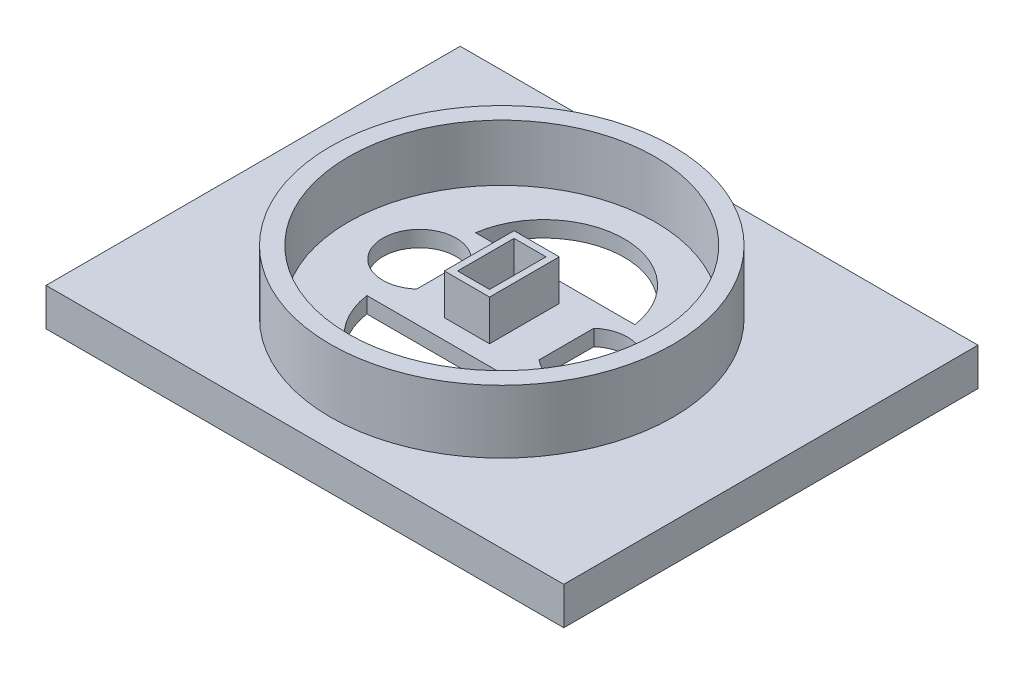
ISO-10303-21;
HEADER;
FILE_DESCRIPTION(('STEP AP214'),'2;1');
FILE_NAME('part.step','',(''),(''),'','','');
FILE_SCHEMA(('AUTOMOTIVE_DESIGN { 1 0 10303 214 1 1 1 1 }'));
ENDSEC;
DATA;
#1=APPLICATION_CONTEXT('core data for automotive mechanical design processes');
#2=APPLICATION_PROTOCOL_DEFINITION('international standard','automotive_design',2000,#1);
#3=PRODUCT_CONTEXT('',#1,'mechanical');
#4=PRODUCT('Part','Part','',(#3));
#5=PRODUCT_RELATED_PRODUCT_CATEGORY('part','',(#4));
#6=PRODUCT_DEFINITION_FORMATION('','',#4);
#7=PRODUCT_DEFINITION_CONTEXT('part definition',#1,'design');
#8=PRODUCT_DEFINITION('design','',#6,#7);
#9=PRODUCT_DEFINITION_SHAPE('','',#8);
#10=(LENGTH_UNIT() NAMED_UNIT(*) SI_UNIT(.MILLI.,.METRE.));
#11=(NAMED_UNIT(*) PLANE_ANGLE_UNIT() SI_UNIT($,.RADIAN.));
#12=(NAMED_UNIT(*) SI_UNIT($,.STERADIAN.) SOLID_ANGLE_UNIT());
#13=UNCERTAINTY_MEASURE_WITH_UNIT(LENGTH_MEASURE(1.E-05),#10,'distance_accuracy_value','');
#14=(GEOMETRIC_REPRESENTATION_CONTEXT(3) GLOBAL_UNCERTAINTY_ASSIGNED_CONTEXT((#13)) GLOBAL_UNIT_ASSIGNED_CONTEXT((#10,
#11,#12)) REPRESENTATION_CONTEXT('',''));
#15=CARTESIAN_POINT('',(0.,0.,0.));
#16=DIRECTION('',(0.,0.,1.));
#17=DIRECTION('',(1.,0.,0.));
#18=AXIS2_PLACEMENT_3D('',#15,#16,#17);
#19=CARTESIAN_POINT('',(0.,5.,0.));
#20=DIRECTION('',(0.,-1.,0.));
#21=DIRECTION('',(0.,0.,-1.));
#22=AXIS2_PLACEMENT_3D('',#19,#20,#21);
#23=PLANE('',#22);
#24=DIRECTION('',(0.,0.,-1.));
#25=VECTOR('',#24,1.);
#26=CARTESIAN_POINT('',(2.4,5.,0.));
#27=LINE('',#26,#25);
#28=CARTESIAN_POINT('',(2.4,5.,50.4904600702146));
#29=VERTEX_POINT('',#28);
#30=CARTESIAN_POINT('',(2.4,5.,43.0904600702146));
#31=VERTEX_POINT('',#30);
#32=EDGE_CURVE('E427',#29,#31,#27,.T.);
#33=ORIENTED_EDGE('',*,*,#32,.T.);
#34=DIRECTION('',(-1.,0.,0.));
#35=VECTOR('',#34,1.);
#36=CARTESIAN_POINT('',(0.,5.,43.0904600702146));
#37=LINE('',#36,#35);
#38=CARTESIAN_POINT('',(-2.4,5.,43.0904600702146));
#39=VERTEX_POINT('',#38);
#40=EDGE_CURVE('E456',#31,#39,#37,.T.);
#41=ORIENTED_EDGE('',*,*,#40,.T.);
#42=DIRECTION('',(0.,0.,1.));
#43=VECTOR('',#42,1.);
#44=CARTESIAN_POINT('',(-2.4,5.,0.));
#45=LINE('',#44,#43);
#46=CARTESIAN_POINT('',(-2.4,5.,50.4904600702146));
#47=VERTEX_POINT('',#46);
#48=EDGE_CURVE('E459',#39,#47,#45,.T.);
#49=ORIENTED_EDGE('',*,*,#48,.T.);
#50=DIRECTION('',(1.,0.,0.));
#51=VECTOR('',#50,1.);
#52=CARTESIAN_POINT('',(0.,5.,50.4904600702146));
#53=LINE('',#52,#51);
#54=EDGE_CURVE('E447',#47,#29,#53,.T.);
#55=ORIENTED_EDGE('',*,*,#54,.T.);
#56=EDGE_LOOP('',(#33,#41,#49,#55));
#57=FACE_BOUND('',#56,.T.);
#58=DIRECTION('',(0.,0.,-1.));
#59=VECTOR('',#58,1.);
#60=CARTESIAN_POINT('',(1.7,5.,43.7904600702146));
#61=LINE('',#60,#59);
#62=CARTESIAN_POINT('',(1.7,5.,49.7904600702146));
#63=VERTEX_POINT('',#62);
#64=CARTESIAN_POINT('',(1.7,5.,43.7904600702146));
#65=VERTEX_POINT('',#64);
#66=EDGE_CURVE('E357',#63,#65,#61,.T.);
#67=ORIENTED_EDGE('',*,*,#66,.F.);
#68=DIRECTION('',(1.,0.,0.));
#69=VECTOR('',#68,1.);
#70=CARTESIAN_POINT('',(1.7,5.,49.7904600702146));
#71=LINE('',#70,#69);
#72=CARTESIAN_POINT('',(-1.7,5.,49.7904600702146));
#73=VERTEX_POINT('',#72);
#74=EDGE_CURVE('E368',#73,#63,#71,.T.);
#75=ORIENTED_EDGE('',*,*,#74,.F.);
#76=DIRECTION('',(0.,0.,1.));
#77=VECTOR('',#76,1.);
#78=CARTESIAN_POINT('',(-1.7,5.,43.7904600702146));
#79=LINE('',#78,#77);
#80=CARTESIAN_POINT('',(-1.7,5.,43.7904600702146));
#81=VERTEX_POINT('',#80);
#82=EDGE_CURVE('E364',#81,#73,#79,.T.);
#83=ORIENTED_EDGE('',*,*,#82,.F.);
#84=DIRECTION('',(-1.,0.,0.));
#85=VECTOR('',#84,1.);
#86=CARTESIAN_POINT('',(1.7,5.,43.7904600702146));
#87=LINE('',#86,#85);
#88=EDGE_CURVE('E360',#65,#81,#87,.T.);
#89=ORIENTED_EDGE('',*,*,#88,.F.);
#90=EDGE_LOOP('',(#67,#75,#83,#89));
#91=FACE_BOUND('',#90,.T.);
#92=ADVANCED_FACE('F42',(#57,#91),#23,.F.);
#93=CARTESIAN_POINT('',(0.,0.7,46.7904600702146));
#94=DIRECTION('',(0.,1.,0.));
#95=DIRECTION('',(0.,0.,1.));
#96=AXIS2_PLACEMENT_3D('',#93,#94,#95);
#97=PLANE('',#96);
#98=CARTESIAN_POINT('',(-0.100326446196328,0.7,42.2169872096025));
#99=DIRECTION('',(0.,1.,0.));
#100=DIRECTION('',(0.,0.,-1.));
#101=AXIS2_PLACEMENT_3D('',#98,#99,#100);
#102=CIRCLE('',#101,8.53948836012272);
#103=CARTESIAN_POINT('',(8.35417371741275,0.7,41.015201689551));
#104=VERTEX_POINT('',#103);
#105=CARTESIAN_POINT('',(-8.55482660980541,0.7,41.015201689551));
#106=VERTEX_POINT('',#105);
#107=EDGE_CURVE('E59',#104,#106,#102,.T.);
#108=ORIENTED_EDGE('',*,*,#107,.F.);
#109=DIRECTION('',(1.,0.,0.));
#110=VECTOR('',#109,1.);
#111=CARTESIAN_POINT('',(-8.55482660980541,0.7,41.015201689551));
#112=LINE('',#111,#110);
#113=EDGE_CURVE('E215',#106,#104,#112,.T.);
#114=ORIENTED_EDGE('',*,*,#113,.F.);
#115=EDGE_LOOP('',(#108,#114));
#116=FACE_BOUND('',#115,.T.);
#117=CARTESIAN_POINT('',(9.10015565162068,0.7,46.429095644084));
#118=DIRECTION('',(0.,1.,0.));
#119=DIRECTION('',(0.,0.,-1.));
#120=AXIS2_PLACEMENT_3D('',#117,#118,#119);
#121=CIRCLE('',#120,3.89068751675184);
#122=CARTESIAN_POINT('',(6.50683123406386,0.7,49.3294607621877));
#123=VERTEX_POINT('',#122);
#124=CARTESIAN_POINT('',(6.50683123406386,0.7,43.5287305259804));
#125=VERTEX_POINT('',#124);
#126=EDGE_CURVE('E67',#123,#125,#121,.T.);
#127=ORIENTED_EDGE('',*,*,#126,.F.);
#128=DIRECTION('',(0.,0.,1.));
#129=VECTOR('',#128,1.);
#130=CARTESIAN_POINT('',(6.50683123406386,0.7,43.5287305259804));
#131=LINE('',#130,#129);
#132=EDGE_CURVE('E233',#125,#123,#131,.T.);
#133=ORIENTED_EDGE('',*,*,#132,.F.);
#134=EDGE_LOOP('',(#127,#133));
#135=FACE_BOUND('',#134,.T.);
#136=CARTESIAN_POINT('',(-9.10015565162067,0.7,46.429095644084));
#137=DIRECTION('',(0.,1.,0.));
#138=DIRECTION('',(0.,0.,1.));
#139=AXIS2_PLACEMENT_3D('',#136,#137,#138);
#140=CIRCLE('',#139,3.89068751675185);
#141=CARTESIAN_POINT('',(-6.50683123406386,0.7,43.5287305259804));
#142=VERTEX_POINT('',#141);
#143=CARTESIAN_POINT('',(-6.50683123406386,0.7,49.3294607621877));
#144=VERTEX_POINT('',#143);
#145=EDGE_CURVE('E241',#142,#144,#140,.T.);
#146=ORIENTED_EDGE('',*,*,#145,.F.);
#147=DIRECTION('',(0.,0.,-1.));
#148=VECTOR('',#147,1.);
#149=CARTESIAN_POINT('',(-6.50683123406386,0.7,43.5287305259804));
#150=LINE('',#149,#148);
#151=EDGE_CURVE('E257',#144,#142,#150,.T.);
#152=ORIENTED_EDGE('',*,*,#151,.F.);
#153=EDGE_LOOP('',(#146,#152));
#154=FACE_BOUND('',#153,.T.);
#155=CARTESIAN_POINT('',(-0.100326446196326,0.7,51.3639329308266));
#156=DIRECTION('',(0.,1.,0.));
#157=DIRECTION('',(0.,0.,1.));
#158=AXIS2_PLACEMENT_3D('',#155,#156,#157);
#159=CIRCLE('',#158,8.53948836012271);
#160=CARTESIAN_POINT('',(-8.5548266098054,0.7,52.5657184508781));
#161=VERTEX_POINT('',#160);
#162=CARTESIAN_POINT('',(8.35417371741275,0.7,52.5657184508781));
#163=VERTEX_POINT('',#162);
#164=EDGE_CURVE('E244',#161,#163,#159,.T.);
#165=ORIENTED_EDGE('',*,*,#164,.F.);
#166=DIRECTION('',(-1.,0.,0.));
#167=VECTOR('',#166,1.);
#168=CARTESIAN_POINT('',(-8.5548266098054,0.7,52.5657184508781));
#169=LINE('',#168,#167);
#170=EDGE_CURVE('E247',#163,#161,#169,.T.);
#171=ORIENTED_EDGE('',*,*,#170,.F.);
#172=EDGE_LOOP('',(#165,#171));
#173=FACE_BOUND('',#172,.T.);
#174=CARTESIAN_POINT('',(0.,0.7,46.7904600702146));
#175=DIRECTION('',(0.,1.,0.));
#176=DIRECTION('',(0.,0.,1.));
#177=AXIS2_PLACEMENT_3D('',#174,#175,#176);
#178=CIRCLE('',#177,16.3);
#179=CARTESIAN_POINT('',(0.,0.7,63.0904600702146));
#180=VERTEX_POINT('',#179);
#181=EDGE_CURVE('E411',#180,#180,#178,.T.);
#182=ORIENTED_EDGE('',*,*,#181,.T.);
#183=EDGE_LOOP('',(#182));
#184=FACE_BOUND('',#183,.T.);
#185=DIRECTION('',(-1.,0.,0.));
#186=VECTOR('',#185,1.);
#187=CARTESIAN_POINT('',(1.7,0.7,43.0904600702146));
#188=LINE('',#187,#186);
#189=CARTESIAN_POINT('',(2.4,0.7,43.0904600702146));
#190=VERTEX_POINT('',#189);
#191=CARTESIAN_POINT('',(-2.4,0.7,43.0904600702146));
#192=VERTEX_POINT('',#191);
#193=EDGE_CURVE('E417',#190,#192,#188,.T.);
#194=ORIENTED_EDGE('',*,*,#193,.F.);
#195=DIRECTION('',(0.,0.,-1.));
#196=VECTOR('',#195,1.);
#197=CARTESIAN_POINT('',(2.4,0.7,43.7904600702146));
#198=LINE('',#197,#196);
#199=CARTESIAN_POINT('',(2.4,0.7,50.4904600702146));
#200=VERTEX_POINT('',#199);
#201=EDGE_CURVE('E410',#200,#190,#198,.T.);
#202=ORIENTED_EDGE('',*,*,#201,.F.);
#203=DIRECTION('',(1.,0.,0.));
#204=VECTOR('',#203,1.);
#205=CARTESIAN_POINT('',(1.7,0.7,50.4904600702146));
#206=LINE('',#205,#204);
#207=CARTESIAN_POINT('',(-2.4,0.7,50.4904600702146));
#208=VERTEX_POINT('',#207);
#209=EDGE_CURVE('E424',#208,#200,#206,.T.);
#210=ORIENTED_EDGE('',*,*,#209,.F.);
#211=DIRECTION('',(0.,0.,1.));
#212=VECTOR('',#211,1.);
#213=CARTESIAN_POINT('',(-2.4,0.7,43.7904600702146));
#214=LINE('',#213,#212);
#215=EDGE_CURVE('E420',#192,#208,#214,.T.);
#216=ORIENTED_EDGE('',*,*,#215,.F.);
#217=EDGE_LOOP('',(#194,#202,#210,#216));
#218=FACE_BOUND('',#217,.T.);
#219=ADVANCED_FACE('F220',(#116,#135,#154,#173,#184,#218),#97,.T.);
#220=CARTESIAN_POINT('',(0.,6.,46.7904600702146));
#221=DIRECTION('',(0.,-1.,0.));
#222=DIRECTION('',(0.,0.,-1.));
#223=AXIS2_PLACEMENT_3D('',#220,#221,#222);
#224=CYLINDRICAL_SURFACE('',#223,18.2);
#225=CARTESIAN_POINT('',(0.,0.,46.7904600702146));
#226=DIRECTION('',(0.,1.,0.));
#227=DIRECTION('',(0.,0.,1.));
#228=AXIS2_PLACEMENT_3D('',#225,#226,#227);
#229=CIRCLE('',#228,18.2);
#230=CARTESIAN_POINT('',(0.,0.,64.9904600702146));
#231=VERTEX_POINT('',#230);
#232=EDGE_CURVE('E352',#231,#231,#229,.T.);
#233=ORIENTED_EDGE('',*,*,#232,.T.);
#234=EDGE_LOOP('',(#233));
#235=FACE_BOUND('',#234,.T.);
#236=CARTESIAN_POINT('',(0.,6.7,46.7904600702146));
#237=DIRECTION('',(0.,1.,0.));
#238=DIRECTION('',(0.,0.,1.));
#239=AXIS2_PLACEMENT_3D('',#236,#237,#238);
#240=CIRCLE('',#239,18.2);
#241=CARTESIAN_POINT('',(0.,6.7,64.9904600702146));
#242=VERTEX_POINT('',#241);
#243=EDGE_CURVE('E434',#242,#242,#240,.T.);
#244=ORIENTED_EDGE('',*,*,#243,.F.);
#245=EDGE_LOOP('',(#244));
#246=FACE_BOUND('',#245,.T.);
#247=ADVANCED_FACE('F570',(#235,#246),#224,.T.);
#248=CARTESIAN_POINT('',(0.,6.7,46.7904600702146));
#249=DIRECTION('',(0.,1.,0.));
#250=DIRECTION('',(0.,0.,1.));
#251=AXIS2_PLACEMENT_3D('',#248,#249,#250);
#252=PLANE('',#251);
#253=CARTESIAN_POINT('',(0.,6.7,46.7904600702146));
#254=DIRECTION('',(0.,1.,0.));
#255=DIRECTION('',(0.,0.,1.));
#256=AXIS2_PLACEMENT_3D('',#253,#254,#255);
#257=CIRCLE('',#256,16.3);
#258=CARTESIAN_POINT('',(0.,6.7,63.0904600702146));
#259=VERTEX_POINT('',#258);
#260=EDGE_CURVE('E415',#259,#259,#257,.T.);
#261=ORIENTED_EDGE('',*,*,#260,.F.);
#262=EDGE_LOOP('',(#261));
#263=FACE_BOUND('',#262,.T.);
#264=ORIENTED_EDGE('',*,*,#243,.T.);
#265=EDGE_LOOP('',(#264));
#266=FACE_BOUND('',#265,.T.);
#267=ADVANCED_FACE('F579',(#263,#266),#252,.T.);
#268=CARTESIAN_POINT('',(0.,6.,46.7904600702146));
#269=DIRECTION('',(0.,-1.,0.));
#270=DIRECTION('',(0.,0.,-1.));
#271=AXIS2_PLACEMENT_3D('',#268,#269,#270);
#272=CYLINDRICAL_SURFACE('',#271,16.3);
#273=ORIENTED_EDGE('',*,*,#260,.T.);
#274=EDGE_LOOP('',(#273));
#275=FACE_BOUND('',#274,.T.);
#276=ORIENTED_EDGE('',*,*,#181,.F.);
#277=EDGE_LOOP('',(#276));
#278=FACE_BOUND('',#277,.T.);
#279=ADVANCED_FACE('F583',(#275,#278),#272,.F.);
#280=CARTESIAN_POINT('',(2.4,5.,43.7904600702146));
#281=DIRECTION('',(-1.,0.,0.));
#282=DIRECTION('',(0.,0.,1.));
#283=AXIS2_PLACEMENT_3D('',#280,#281,#282);
#284=PLANE('',#283);
#285=ORIENTED_EDGE('',*,*,#201,.T.);
#286=DIRECTION('',(0.,-1.,0.));
#287=VECTOR('',#286,1.);
#288=CARTESIAN_POINT('',(2.4,5.,43.0904600702146));
#289=LINE('',#288,#287);
#290=EDGE_CURVE('E416',#31,#190,#289,.T.);
#291=ORIENTED_EDGE('',*,*,#290,.F.);
#292=ORIENTED_EDGE('',*,*,#32,.F.);
#293=DIRECTION('',(0.,-1.,0.));
#294=VECTOR('',#293,1.);
#295=CARTESIAN_POINT('',(2.4,5.,50.4904600702146));
#296=LINE('',#295,#294);
#297=EDGE_CURVE('E442',#29,#200,#296,.T.);
#298=ORIENTED_EDGE('',*,*,#297,.T.);
#299=EDGE_LOOP('',(#285,#291,#292,#298));
#300=FACE_BOUND('',#299,.T.);
#301=ADVANCED_FACE('F587',(#300),#284,.F.);
#302=CARTESIAN_POINT('',(1.7,5.,43.0904600702146));
#303=DIRECTION('',(0.,0.,1.));
#304=DIRECTION('',(1.,0.,0.));
#305=AXIS2_PLACEMENT_3D('',#302,#303,#304);
#306=PLANE('',#305);
#307=ORIENTED_EDGE('',*,*,#193,.T.);
#308=DIRECTION('',(0.,-1.,0.));
#309=VECTOR('',#308,1.);
#310=CARTESIAN_POINT('',(-2.4,5.,43.0904600702146));
#311=LINE('',#310,#309);
#312=EDGE_CURVE('E441',#39,#192,#311,.T.);
#313=ORIENTED_EDGE('',*,*,#312,.F.);
#314=ORIENTED_EDGE('',*,*,#40,.F.);
#315=ORIENTED_EDGE('',*,*,#290,.T.);
#316=EDGE_LOOP('',(#307,#313,#314,#315));
#317=FACE_BOUND('',#316,.T.);
#318=ADVANCED_FACE('F591',(#317),#306,.F.);
#319=CARTESIAN_POINT('',(-2.4,5.,43.7904600702146));
#320=DIRECTION('',(1.,0.,0.));
#321=DIRECTION('',(0.,0.,-1.));
#322=AXIS2_PLACEMENT_3D('',#319,#320,#321);
#323=PLANE('',#322);
#324=ORIENTED_EDGE('',*,*,#215,.T.);
#325=DIRECTION('',(0.,-1.,0.));
#326=VECTOR('',#325,1.);
#327=CARTESIAN_POINT('',(-2.4,5.,50.4904600702146));
#328=LINE('',#327,#326);
#329=EDGE_CURVE('E446',#47,#208,#328,.T.);
#330=ORIENTED_EDGE('',*,*,#329,.F.);
#331=ORIENTED_EDGE('',*,*,#48,.F.);
#332=ORIENTED_EDGE('',*,*,#312,.T.);
#333=EDGE_LOOP('',(#324,#330,#331,#332));
#334=FACE_BOUND('',#333,.T.);
#335=ADVANCED_FACE('F594',(#334),#323,.F.);
#336=CARTESIAN_POINT('',(1.7,5.,50.4904600702146));
#337=DIRECTION('',(0.,0.,-1.));
#338=DIRECTION('',(-1.,0.,0.));
#339=AXIS2_PLACEMENT_3D('',#336,#337,#338);
#340=PLANE('',#339);
#341=ORIENTED_EDGE('',*,*,#209,.T.);
#342=ORIENTED_EDGE('',*,*,#297,.F.);
#343=ORIENTED_EDGE('',*,*,#54,.F.);
#344=ORIENTED_EDGE('',*,*,#329,.T.);
#345=EDGE_LOOP('',(#341,#342,#343,#344));
#346=FACE_BOUND('',#345,.T.);
#347=ADVANCED_FACE('F44',(#346),#340,.F.);
#348=CARTESIAN_POINT('',(1.7,5.,43.7904600702146));
#349=DIRECTION('',(-1.,0.,0.));
#350=DIRECTION('',(0.,0.,1.));
#351=AXIS2_PLACEMENT_3D('',#348,#349,#350);
#352=PLANE('',#351);
#353=DIRECTION('',(0.,0.,-1.));
#354=VECTOR('',#353,1.);
#355=CARTESIAN_POINT('',(1.7,0.,43.7904600702146));
#356=LINE('',#355,#354);
#357=CARTESIAN_POINT('',(1.7,0.,49.7904600702146));
#358=VERTEX_POINT('',#357);
#359=CARTESIAN_POINT('',(1.7,0.,43.7904600702146));
#360=VERTEX_POINT('',#359);
#361=EDGE_CURVE('E372',#358,#360,#356,.T.);
#362=ORIENTED_EDGE('',*,*,#361,.F.);
#363=DIRECTION('',(0.,-1.,0.));
#364=VECTOR('',#363,1.);
#365=CARTESIAN_POINT('',(1.7,5.,49.7904600702146));
#366=LINE('',#365,#364);
#367=EDGE_CURVE('E371',#63,#358,#366,.T.);
#368=ORIENTED_EDGE('',*,*,#367,.F.);
#369=ORIENTED_EDGE('',*,*,#66,.T.);
#370=DIRECTION('',(0.,-1.,0.));
#371=VECTOR('',#370,1.);
#372=CARTESIAN_POINT('',(1.7,5.,43.7904600702146));
#373=LINE('',#372,#371);
#374=EDGE_CURVE('E395',#65,#360,#373,.T.);
#375=ORIENTED_EDGE('',*,*,#374,.T.);
#376=EDGE_LOOP('',(#362,#368,#369,#375));
#377=FACE_BOUND('',#376,.T.);
#378=ADVANCED_FACE('F601',(#377),#352,.T.);
#379=CARTESIAN_POINT('',(1.7,5.,43.7904600702146));
#380=DIRECTION('',(0.,0.,1.));
#381=DIRECTION('',(1.,0.,0.));
#382=AXIS2_PLACEMENT_3D('',#379,#380,#381);
#383=PLANE('',#382);
#384=DIRECTION('',(-1.,0.,0.));
#385=VECTOR('',#384,1.);
#386=CARTESIAN_POINT('',(1.7,0.,43.7904600702146));
#387=LINE('',#386,#385);
#388=CARTESIAN_POINT('',(-1.7,0.,43.7904600702146));
#389=VERTEX_POINT('',#388);
#390=EDGE_CURVE('E376',#360,#389,#387,.T.);
#391=ORIENTED_EDGE('',*,*,#390,.F.);
#392=ORIENTED_EDGE('',*,*,#374,.F.);
#393=ORIENTED_EDGE('',*,*,#88,.T.);
#394=DIRECTION('',(0.,-1.,0.));
#395=VECTOR('',#394,1.);
#396=CARTESIAN_POINT('',(-1.7,5.,43.7904600702146));
#397=LINE('',#396,#395);
#398=EDGE_CURVE('E392',#81,#389,#397,.T.);
#399=ORIENTED_EDGE('',*,*,#398,.T.);
#400=EDGE_LOOP('',(#391,#392,#393,#399));
#401=FACE_BOUND('',#400,.T.);
#402=ADVANCED_FACE('F618',(#401),#383,.T.);
#403=CARTESIAN_POINT('',(-1.7,5.,43.7904600702146));
#404=DIRECTION('',(1.,0.,0.));
#405=DIRECTION('',(0.,0.,-1.));
#406=AXIS2_PLACEMENT_3D('',#403,#404,#405);
#407=PLANE('',#406);
#408=DIRECTION('',(0.,0.,1.));
#409=VECTOR('',#408,1.);
#410=CARTESIAN_POINT('',(-1.7,0.,43.7904600702146));
#411=LINE('',#410,#409);
#412=CARTESIAN_POINT('',(-1.7,0.,49.7904600702146));
#413=VERTEX_POINT('',#412);
#414=EDGE_CURVE('E380',#389,#413,#411,.T.);
#415=ORIENTED_EDGE('',*,*,#414,.F.);
#416=ORIENTED_EDGE('',*,*,#398,.F.);
#417=ORIENTED_EDGE('',*,*,#82,.T.);
#418=DIRECTION('',(0.,-1.,0.));
#419=VECTOR('',#418,1.);
#420=CARTESIAN_POINT('',(-1.7,5.,49.7904600702146));
#421=LINE('',#420,#419);
#422=EDGE_CURVE('E389',#73,#413,#421,.T.);
#423=ORIENTED_EDGE('',*,*,#422,.T.);
#424=EDGE_LOOP('',(#415,#416,#417,#423));
#425=FACE_BOUND('',#424,.T.);
#426=ADVANCED_FACE('F553',(#425),#407,.T.);
#427=CARTESIAN_POINT('',(1.7,5.,49.7904600702146));
#428=DIRECTION('',(0.,0.,-1.));
#429=DIRECTION('',(-1.,0.,0.));
#430=AXIS2_PLACEMENT_3D('',#427,#428,#429);
#431=PLANE('',#430);
#432=DIRECTION('',(1.,0.,0.));
#433=VECTOR('',#432,1.);
#434=CARTESIAN_POINT('',(1.7,0.,49.7904600702146));
#435=LINE('',#434,#433);
#436=EDGE_CURVE('E361',#413,#358,#435,.T.);
#437=ORIENTED_EDGE('',*,*,#436,.F.);
#438=ORIENTED_EDGE('',*,*,#422,.F.);
#439=ORIENTED_EDGE('',*,*,#74,.T.);
#440=ORIENTED_EDGE('',*,*,#367,.T.);
#441=EDGE_LOOP('',(#437,#438,#439,#440));
#442=FACE_BOUND('',#441,.T.);
#443=ADVANCED_FACE('F545',(#442),#431,.T.);
#444=CARTESIAN_POINT('',(0.,0.,0.));
#445=DIRECTION('',(0.,1.,0.));
#446=DIRECTION('',(0.,0.,1.));
#447=AXIS2_PLACEMENT_3D('',#444,#445,#446);
#448=PLANE('',#447);
#449=ORIENTED_EDGE('',*,*,#232,.F.);
#450=EDGE_LOOP('',(#449));
#451=FACE_BOUND('',#450,.T.);
#452=DIRECTION('',(-1.,0.,0.));
#453=VECTOR('',#452,1.);
#454=CARTESIAN_POINT('',(27.7675454174685,0.,67.974099662761));
#455=LINE('',#454,#453);
#456=CARTESIAN_POINT('',(27.7675454174685,0.,67.974099662761));
#457=VERTEX_POINT('',#456);
#458=CARTESIAN_POINT('',(-27.2324545825315,0.,67.974099662761));
#459=VERTEX_POINT('',#458);
#460=EDGE_CURVE('E301',#457,#459,#455,.T.);
#461=ORIENTED_EDGE('',*,*,#460,.F.);
#462=DIRECTION('',(0.,0.,1.));
#463=VECTOR('',#462,1.);
#464=CARTESIAN_POINT('',(27.7675454174685,0.,23.9740996627611));
#465=LINE('',#464,#463);
#466=CARTESIAN_POINT('',(27.7675454174685,0.,23.9740996627611));
#467=VERTEX_POINT('',#466);
#468=EDGE_CURVE('E315',#467,#457,#465,.T.);
#469=ORIENTED_EDGE('',*,*,#468,.F.);
#470=DIRECTION('',(-1.,0.,0.));
#471=VECTOR('',#470,1.);
#472=CARTESIAN_POINT('',(27.7675454174685,0.,23.9740996627611));
#473=LINE('',#472,#471);
#474=CARTESIAN_POINT('',(-27.2324545825315,0.,23.974099662761));
#475=VERTEX_POINT('',#474);
#476=EDGE_CURVE('E334',#467,#475,#473,.T.);
#477=ORIENTED_EDGE('',*,*,#476,.T.);
#478=DIRECTION('',(0.,0.,1.));
#479=VECTOR('',#478,1.);
#480=CARTESIAN_POINT('',(-27.2324545825315,0.,23.974099662761));
#481=LINE('',#480,#479);
#482=EDGE_CURVE('E330',#475,#459,#481,.T.);
#483=ORIENTED_EDGE('',*,*,#482,.T.);
#484=EDGE_LOOP('',(#461,#469,#477,#483));
#485=FACE_BOUND('',#484,.T.);
#486=ADVANCED_FACE('F524',(#451,#485),#448,.T.);
#487=CARTESIAN_POINT('',(0.,-4.,0.));
#488=DIRECTION('',(0.,1.,0.));
#489=DIRECTION('',(0.,0.,1.));
#490=AXIS2_PLACEMENT_3D('',#487,#488,#489);
#491=PLANE('',#490);
#492=DIRECTION('',(-1.,0.,0.));
#493=VECTOR('',#492,1.);
#494=CARTESIAN_POINT('',(26.3354418438767,-4.,66.5708787902191));
#495=LINE('',#494,#493);
#496=CARTESIAN_POINT('',(26.3354418438767,-4.,66.5708787902191));
#497=VERTEX_POINT('',#496);
#498=CARTESIAN_POINT('',(-25.9190201233016,-4.,66.5708787902191));
#499=VERTEX_POINT('',#498);
#500=EDGE_CURVE('E287',#497,#499,#495,.T.);
#501=ORIENTED_EDGE('',*,*,#500,.F.);
#502=DIRECTION('',(0.,0.,1.));
#503=VECTOR('',#502,1.);
#504=CARTESIAN_POINT('',(26.3354418438767,-4.,25.4800692386375));
#505=LINE('',#504,#503);
#506=CARTESIAN_POINT('',(26.3354418438767,-4.,25.4800692386375));
#507=VERTEX_POINT('',#506);
#508=EDGE_CURVE('E211',#507,#497,#505,.T.);
#509=ORIENTED_EDGE('',*,*,#508,.F.);
#510=DIRECTION('',(1.,0.,0.));
#511=VECTOR('',#510,1.);
#512=CARTESIAN_POINT('',(26.3354418438767,-4.,25.4800692386375));
#513=LINE('',#512,#511);
#514=CARTESIAN_POINT('',(-25.9190201233016,-4.,25.4800692386375));
#515=VERTEX_POINT('',#514);
#516=EDGE_CURVE('E272',#515,#507,#513,.T.);
#517=ORIENTED_EDGE('',*,*,#516,.F.);
#518=DIRECTION('',(0.,0.,-1.));
#519=VECTOR('',#518,1.);
#520=CARTESIAN_POINT('',(-25.9190201233016,-4.,25.4800692386375));
#521=LINE('',#520,#519);
#522=EDGE_CURVE('E291',#499,#515,#521,.T.);
#523=ORIENTED_EDGE('',*,*,#522,.F.);
#524=EDGE_LOOP('',(#501,#509,#517,#523));
#525=FACE_BOUND('',#524,.T.);
#526=DIRECTION('',(-1.,0.,0.));
#527=VECTOR('',#526,1.);
#528=CARTESIAN_POINT('',(27.7675454174685,-4.,67.974099662761));
#529=LINE('',#528,#527);
#530=CARTESIAN_POINT('',(27.7675454174685,-4.,67.974099662761));
#531=VERTEX_POINT('',#530);
#532=CARTESIAN_POINT('',(-27.2324545825315,-4.,67.974099662761));
#533=VERTEX_POINT('',#532);
#534=EDGE_CURVE('E311',#531,#533,#529,.T.);
#535=ORIENTED_EDGE('',*,*,#534,.T.);
#536=DIRECTION('',(0.,0.,1.));
#537=VECTOR('',#536,1.);
#538=CARTESIAN_POINT('',(-27.2324545825315,-4.,23.974099662761));
#539=LINE('',#538,#537);
#540=CARTESIAN_POINT('',(-27.2324545825315,-4.,23.974099662761));
#541=VERTEX_POINT('',#540);
#542=EDGE_CURVE('E314',#541,#533,#539,.T.);
#543=ORIENTED_EDGE('',*,*,#542,.F.);
#544=DIRECTION('',(-1.,0.,0.));
#545=VECTOR('',#544,1.);
#546=CARTESIAN_POINT('',(27.7675454174685,-4.,23.9740996627611));
#547=LINE('',#546,#545);
#548=CARTESIAN_POINT('',(27.7675454174685,-4.,23.9740996627611));
#549=VERTEX_POINT('',#548);
#550=EDGE_CURVE('E319',#549,#541,#547,.T.);
#551=ORIENTED_EDGE('',*,*,#550,.F.);
#552=DIRECTION('',(0.,0.,1.));
#553=VECTOR('',#552,1.);
#554=CARTESIAN_POINT('',(27.7675454174685,-4.,23.9740996627611));
#555=LINE('',#554,#553);
#556=EDGE_CURVE('E323',#549,#531,#555,.T.);
#557=ORIENTED_EDGE('',*,*,#556,.T.);
#558=EDGE_LOOP('',(#535,#543,#551,#557));
#559=FACE_BOUND('',#558,.T.);
#560=ADVANCED_FACE('F520',(#525,#559),#491,.F.);
#561=CARTESIAN_POINT('',(27.7675454174685,-4.,23.9740996627611));
#562=DIRECTION('',(-1.,0.,0.));
#563=DIRECTION('',(0.,0.,1.));
#564=AXIS2_PLACEMENT_3D('',#561,#562,#563);
#565=PLANE('',#564);
#566=ORIENTED_EDGE('',*,*,#468,.T.);
#567=DIRECTION('',(0.,1.,0.));
#568=VECTOR('',#567,1.);
#569=CARTESIAN_POINT('',(27.7675454174685,-4.,67.974099662761));
#570=LINE('',#569,#568);
#571=EDGE_CURVE('E326',#531,#457,#570,.T.);
#572=ORIENTED_EDGE('',*,*,#571,.F.);
#573=ORIENTED_EDGE('',*,*,#556,.F.);
#574=DIRECTION('',(0.,1.,0.));
#575=VECTOR('',#574,1.);
#576=CARTESIAN_POINT('',(27.7675454174685,-4.,23.9740996627611));
#577=LINE('',#576,#575);
#578=EDGE_CURVE('E343',#549,#467,#577,.T.);
#579=ORIENTED_EDGE('',*,*,#578,.T.);
#580=EDGE_LOOP('',(#566,#572,#573,#579));
#581=FACE_BOUND('',#580,.T.);
#582=ADVANCED_FACE('F523',(#581),#565,.F.);
#583=CARTESIAN_POINT('',(27.7675454174685,-4.,23.9740996627611));
#584=DIRECTION('',(0.,0.,-1.));
#585=DIRECTION('',(-1.,0.,0.));
#586=AXIS2_PLACEMENT_3D('',#583,#584,#585);
#587=PLANE('',#586);
#588=ORIENTED_EDGE('',*,*,#476,.F.);
#589=ORIENTED_EDGE('',*,*,#578,.F.);
#590=ORIENTED_EDGE('',*,*,#550,.T.);
#591=DIRECTION('',(0.,1.,0.));
#592=VECTOR('',#591,1.);
#593=CARTESIAN_POINT('',(-27.2324545825315,-4.,23.974099662761));
#594=LINE('',#593,#592);
#595=EDGE_CURVE('E346',#541,#475,#594,.T.);
#596=ORIENTED_EDGE('',*,*,#595,.T.);
#597=EDGE_LOOP('',(#588,#589,#590,#596));
#598=FACE_BOUND('',#597,.T.);
#599=ADVANCED_FACE('F540',(#598),#587,.T.);
#600=CARTESIAN_POINT('',(-27.2324545825315,-4.,23.974099662761));
#601=DIRECTION('',(-1.,0.,0.));
#602=DIRECTION('',(0.,0.,1.));
#603=AXIS2_PLACEMENT_3D('',#600,#601,#602);
#604=PLANE('',#603);
#605=ORIENTED_EDGE('',*,*,#482,.F.);
#606=ORIENTED_EDGE('',*,*,#595,.F.);
#607=ORIENTED_EDGE('',*,*,#542,.T.);
#608=DIRECTION('',(0.,1.,0.));
#609=VECTOR('',#608,1.);
#610=CARTESIAN_POINT('',(-27.2324545825315,-4.,67.974099662761));
#611=LINE('',#610,#609);
#612=EDGE_CURVE('E349',#533,#459,#611,.T.);
#613=ORIENTED_EDGE('',*,*,#612,.T.);
#614=EDGE_LOOP('',(#605,#606,#607,#613));
#615=FACE_BOUND('',#614,.T.);
#616=ADVANCED_FACE('F537',(#615),#604,.T.);
#617=CARTESIAN_POINT('',(27.7675454174685,-4.,67.974099662761));
#618=DIRECTION('',(0.,0.,-1.));
#619=DIRECTION('',(-1.,0.,0.));
#620=AXIS2_PLACEMENT_3D('',#617,#618,#619);
#621=PLANE('',#620);
#622=ORIENTED_EDGE('',*,*,#460,.T.);
#623=ORIENTED_EDGE('',*,*,#612,.F.);
#624=ORIENTED_EDGE('',*,*,#534,.F.);
#625=ORIENTED_EDGE('',*,*,#571,.T.);
#626=EDGE_LOOP('',(#622,#623,#624,#625));
#627=FACE_BOUND('',#626,.T.);
#628=ADVANCED_FACE('F533',(#627),#621,.F.);
#629=ORIENTED_EDGE('',*,*,#361,.T.);
#630=ORIENTED_EDGE('',*,*,#390,.T.);
#631=ORIENTED_EDGE('',*,*,#414,.T.);
#632=ORIENTED_EDGE('',*,*,#436,.T.);
#633=EDGE_LOOP('',(#629,#630,#631,#632));
#634=FACE_BOUND('',#633,.T.);
#635=ADVANCED_FACE('F548',(#634),#448,.T.);
#636=CARTESIAN_POINT('',(26.3354418438767,-1.,25.4800692386375));
#637=DIRECTION('',(1.,0.,0.));
#638=DIRECTION('',(0.,0.,-1.));
#639=AXIS2_PLACEMENT_3D('',#636,#637,#638);
#640=PLANE('',#639);
#641=ORIENTED_EDGE('',*,*,#508,.T.);
#642=DIRECTION('',(0.,-1.,0.));
#643=VECTOR('',#642,1.);
#644=CARTESIAN_POINT('',(26.3354418438767,-1.,66.5708787902191));
#645=LINE('',#644,#643);
#646=CARTESIAN_POINT('',(26.3354418438767,-1.,66.5708787902191));
#647=VERTEX_POINT('',#646);
#648=EDGE_CURVE('E284',#647,#497,#645,.T.);
#649=ORIENTED_EDGE('',*,*,#648,.F.);
#650=DIRECTION('',(0.,0.,1.));
#651=VECTOR('',#650,1.);
#652=CARTESIAN_POINT('',(26.3354418438767,-1.,25.4800692386375));
#653=LINE('',#652,#651);
#654=CARTESIAN_POINT('',(26.3354418438767,-1.,25.4800692386375));
#655=VERTEX_POINT('',#654);
#656=EDGE_CURVE('E267',#655,#647,#653,.T.);
#657=ORIENTED_EDGE('',*,*,#656,.F.);
#658=DIRECTION('',(0.,-1.,0.));
#659=VECTOR('',#658,1.);
#660=CARTESIAN_POINT('',(26.3354418438767,-1.,25.4800692386375));
#661=LINE('',#660,#659);
#662=EDGE_CURVE('E298',#655,#507,#661,.T.);
#663=ORIENTED_EDGE('',*,*,#662,.T.);
#664=EDGE_LOOP('',(#641,#649,#657,#663));
#665=FACE_BOUND('',#664,.T.);
#666=ADVANCED_FACE('F508',(#665),#640,.F.);
#667=CARTESIAN_POINT('',(26.3354418438767,-1.,25.4800692386375));
#668=DIRECTION('',(0.,0.,-1.));
#669=DIRECTION('',(-1.,0.,0.));
#670=AXIS2_PLACEMENT_3D('',#667,#668,#669);
#671=PLANE('',#670);
#672=ORIENTED_EDGE('',*,*,#516,.T.);
#673=ORIENTED_EDGE('',*,*,#662,.F.);
#674=DIRECTION('',(1.,0.,0.));
#675=VECTOR('',#674,1.);
#676=CARTESIAN_POINT('',(26.3354418438767,-1.,25.4800692386375));
#677=LINE('',#676,#675);
#678=CARTESIAN_POINT('',(-25.9190201233016,-1.,25.4800692386375));
#679=VERTEX_POINT('',#678);
#680=EDGE_CURVE('E280',#679,#655,#677,.T.);
#681=ORIENTED_EDGE('',*,*,#680,.F.);
#682=DIRECTION('',(0.,-1.,0.));
#683=VECTOR('',#682,1.);
#684=CARTESIAN_POINT('',(-25.9190201233016,-1.,25.4800692386375));
#685=LINE('',#684,#683);
#686=EDGE_CURVE('E302',#679,#515,#685,.T.);
#687=ORIENTED_EDGE('',*,*,#686,.T.);
#688=EDGE_LOOP('',(#672,#673,#681,#687));
#689=FACE_BOUND('',#688,.T.);
#690=ADVANCED_FACE('F517',(#689),#671,.F.);
#691=CARTESIAN_POINT('',(-25.9190201233016,-1.,25.4800692386375));
#692=DIRECTION('',(-1.,0.,0.));
#693=DIRECTION('',(0.,0.,1.));
#694=AXIS2_PLACEMENT_3D('',#691,#692,#693);
#695=PLANE('',#694);
#696=ORIENTED_EDGE('',*,*,#522,.T.);
#697=ORIENTED_EDGE('',*,*,#686,.F.);
#698=DIRECTION('',(0.,0.,-1.));
#699=VECTOR('',#698,1.);
#700=CARTESIAN_POINT('',(-25.9190201233016,-1.,25.4800692386375));
#701=LINE('',#700,#699);
#702=CARTESIAN_POINT('',(-25.9190201233016,-1.,66.5708787902191));
#703=VERTEX_POINT('',#702);
#704=EDGE_CURVE('E276',#703,#679,#701,.T.);
#705=ORIENTED_EDGE('',*,*,#704,.F.);
#706=DIRECTION('',(0.,-1.,0.));
#707=VECTOR('',#706,1.);
#708=CARTESIAN_POINT('',(-25.9190201233016,-1.,66.5708787902191));
#709=LINE('',#708,#707);
#710=EDGE_CURVE('E305',#703,#499,#709,.T.);
#711=ORIENTED_EDGE('',*,*,#710,.T.);
#712=EDGE_LOOP('',(#696,#697,#705,#711));
#713=FACE_BOUND('',#712,.T.);
#714=ADVANCED_FACE('F515',(#713),#695,.F.);
#715=CARTESIAN_POINT('',(26.3354418438767,-1.,66.5708787902191));
#716=DIRECTION('',(0.,0.,1.));
#717=DIRECTION('',(1.,0.,0.));
#718=AXIS2_PLACEMENT_3D('',#715,#716,#717);
#719=PLANE('',#718);
#720=ORIENTED_EDGE('',*,*,#500,.T.);
#721=ORIENTED_EDGE('',*,*,#710,.F.);
#722=DIRECTION('',(-1.,0.,0.));
#723=VECTOR('',#722,1.);
#724=CARTESIAN_POINT('',(26.3354418438767,-1.,66.5708787902191));
#725=LINE('',#724,#723);
#726=EDGE_CURVE('E271',#647,#703,#725,.T.);
#727=ORIENTED_EDGE('',*,*,#726,.F.);
#728=ORIENTED_EDGE('',*,*,#648,.T.);
#729=EDGE_LOOP('',(#720,#721,#727,#728));
#730=FACE_BOUND('',#729,.T.);
#731=ADVANCED_FACE('F493',(#730),#719,.F.);
#732=CARTESIAN_POINT('',(0.,-1.,0.));
#733=DIRECTION('',(0.,-1.,0.));
#734=DIRECTION('',(0.,0.,-1.));
#735=AXIS2_PLACEMENT_3D('',#732,#733,#734);
#736=PLANE('',#735);
#737=CARTESIAN_POINT('',(-0.100326446196328,-1.,42.2169872096025));
#738=DIRECTION('',(0.,-1.,0.));
#739=DIRECTION('',(0.,0.,-1.));
#740=AXIS2_PLACEMENT_3D('',#737,#738,#739);
#741=CIRCLE('',#740,8.53948836012272);
#742=CARTESIAN_POINT('',(-8.55482660980541,-1.,41.015201689551));
#743=VERTEX_POINT('',#742);
#744=CARTESIAN_POINT('',(8.35417371741275,-1.,41.015201689551));
#745=VERTEX_POINT('',#744);
#746=EDGE_CURVE('E11',#743,#745,#741,.T.);
#747=ORIENTED_EDGE('',*,*,#746,.F.);
#748=DIRECTION('',(-1.,0.,0.));
#749=VECTOR('',#748,1.);
#750=CARTESIAN_POINT('',(0.,-1.,41.015201689551));
#751=LINE('',#750,#749);
#752=EDGE_CURVE('E52',#745,#743,#751,.T.);
#753=ORIENTED_EDGE('',*,*,#752,.F.);
#754=EDGE_LOOP('',(#747,#753));
#755=FACE_BOUND('',#754,.T.);
#756=CARTESIAN_POINT('',(9.10015565162068,-1.,46.429095644084));
#757=DIRECTION('',(0.,-1.,0.));
#758=DIRECTION('',(0.,0.,-1.));
#759=AXIS2_PLACEMENT_3D('',#756,#757,#758);
#760=CIRCLE('',#759,3.89068751675184);
#761=CARTESIAN_POINT('',(6.50683123406386,-1.,43.5287305259804));
#762=VERTEX_POINT('',#761);
#763=CARTESIAN_POINT('',(6.50683123406386,-1.,49.3294607621877));
#764=VERTEX_POINT('',#763);
#765=EDGE_CURVE('E484',#762,#764,#760,.T.);
#766=ORIENTED_EDGE('',*,*,#765,.F.);
#767=DIRECTION('',(0.,0.,-1.));
#768=VECTOR('',#767,1.);
#769=CARTESIAN_POINT('',(6.50683123406385,-1.,0.));
#770=LINE('',#769,#768);
#771=EDGE_CURVE('E481',#764,#762,#770,.T.);
#772=ORIENTED_EDGE('',*,*,#771,.F.);
#773=EDGE_LOOP('',(#766,#772));
#774=FACE_BOUND('',#773,.T.);
#775=CARTESIAN_POINT('',(-9.10015565162067,-1.,46.429095644084));
#776=DIRECTION('',(0.,-1.,0.));
#777=DIRECTION('',(0.,0.,-1.));
#778=AXIS2_PLACEMENT_3D('',#775,#776,#777);
#779=CIRCLE('',#778,3.89068751675185);
#780=CARTESIAN_POINT('',(-6.50683123406386,-1.,49.3294607621877));
#781=VERTEX_POINT('',#780);
#782=CARTESIAN_POINT('',(-6.50683123406386,-1.,43.5287305259804));
#783=VERTEX_POINT('',#782);
#784=EDGE_CURVE('E477',#781,#783,#779,.T.);
#785=ORIENTED_EDGE('',*,*,#784,.F.);
#786=DIRECTION('',(0.,0.,1.));
#787=VECTOR('',#786,1.);
#788=CARTESIAN_POINT('',(-6.50683123406386,-1.,0.));
#789=LINE('',#788,#787);
#790=EDGE_CURVE('E474',#783,#781,#789,.T.);
#791=ORIENTED_EDGE('',*,*,#790,.F.);
#792=EDGE_LOOP('',(#785,#791));
#793=FACE_BOUND('',#792,.T.);
#794=CARTESIAN_POINT('',(-0.100326446196326,-1.,51.3639329308266));
#795=DIRECTION('',(0.,-1.,0.));
#796=DIRECTION('',(0.,0.,-1.));
#797=AXIS2_PLACEMENT_3D('',#794,#795,#796);
#798=CIRCLE('',#797,8.53948836012271);
#799=CARTESIAN_POINT('',(8.35417371741275,-1.,52.5657184508781));
#800=VERTEX_POINT('',#799);
#801=CARTESIAN_POINT('',(-8.5548266098054,-1.,52.5657184508781));
#802=VERTEX_POINT('',#801);
#803=EDGE_CURVE('E470',#800,#802,#798,.T.);
#804=ORIENTED_EDGE('',*,*,#803,.F.);
#805=DIRECTION('',(1.,0.,0.));
#806=VECTOR('',#805,1.);
#807=CARTESIAN_POINT('',(0.,-1.,52.5657184508781));
#808=LINE('',#807,#806);
#809=EDGE_CURVE('E467',#802,#800,#808,.T.);
#810=ORIENTED_EDGE('',*,*,#809,.F.);
#811=EDGE_LOOP('',(#804,#810));
#812=FACE_BOUND('',#811,.T.);
#813=ORIENTED_EDGE('',*,*,#656,.T.);
#814=ORIENTED_EDGE('',*,*,#726,.T.);
#815=ORIENTED_EDGE('',*,*,#704,.T.);
#816=ORIENTED_EDGE('',*,*,#680,.T.);
#817=EDGE_LOOP('',(#813,#814,#815,#816));
#818=FACE_BOUND('',#817,.T.);
#819=ADVANCED_FACE('F489',(#755,#774,#793,#812,#818),#736,.T.);
#820=CARTESIAN_POINT('',(-0.100326446196326,-4.,51.3639329308266));
#821=DIRECTION('',(0.,1.,0.));
#822=DIRECTION('',(0.,0.,1.));
#823=AXIS2_PLACEMENT_3D('',#820,#821,#822);
#824=CYLINDRICAL_SURFACE('',#823,8.53948836012271);
#825=ORIENTED_EDGE('',*,*,#803,.T.);
#826=DIRECTION('',(0.,1.,0.));
#827=VECTOR('',#826,1.);
#828=CARTESIAN_POINT('',(-8.5548266098054,-4.,52.5657184508781));
#829=LINE('',#828,#827);
#830=EDGE_CURVE('E223',#802,#161,#829,.T.);
#831=ORIENTED_EDGE('',*,*,#830,.T.);
#832=ORIENTED_EDGE('',*,*,#164,.T.);
#833=DIRECTION('',(0.,1.,0.));
#834=VECTOR('',#833,1.);
#835=CARTESIAN_POINT('',(8.35417371741275,-4.,52.5657184508781));
#836=LINE('',#835,#834);
#837=EDGE_CURVE('E226',#800,#163,#836,.T.);
#838=ORIENTED_EDGE('',*,*,#837,.F.);
#839=EDGE_LOOP('',(#825,#831,#832,#838));
#840=FACE_BOUND('',#839,.T.);
#841=ADVANCED_FACE('F492',(#840),#824,.F.);
#842=CARTESIAN_POINT('',(-8.5548266098054,-4.,52.5657184508781));
#843=DIRECTION('',(0.,0.,-1.));
#844=DIRECTION('',(-1.,0.,0.));
#845=AXIS2_PLACEMENT_3D('',#842,#843,#844);
#846=PLANE('',#845);
#847=ORIENTED_EDGE('',*,*,#809,.T.);
#848=ORIENTED_EDGE('',*,*,#837,.T.);
#849=ORIENTED_EDGE('',*,*,#170,.T.);
#850=ORIENTED_EDGE('',*,*,#830,.F.);
#851=EDGE_LOOP('',(#847,#848,#849,#850));
#852=FACE_BOUND('',#851,.T.);
#853=ADVANCED_FACE('F718',(#852),#846,.F.);
#854=CARTESIAN_POINT('',(-9.10015565162067,-4.,46.429095644084));
#855=DIRECTION('',(0.,1.,0.));
#856=DIRECTION('',(0.,0.,1.));
#857=AXIS2_PLACEMENT_3D('',#854,#855,#856);
#858=CYLINDRICAL_SURFACE('',#857,3.89068751675185);
#859=ORIENTED_EDGE('',*,*,#784,.T.);
#860=DIRECTION('',(0.,1.,0.));
#861=VECTOR('',#860,1.);
#862=CARTESIAN_POINT('',(-6.50683123406386,-4.,43.5287305259804));
#863=LINE('',#862,#861);
#864=EDGE_CURVE('E248',#783,#142,#863,.T.);
#865=ORIENTED_EDGE('',*,*,#864,.T.);
#866=ORIENTED_EDGE('',*,*,#145,.T.);
#867=DIRECTION('',(0.,1.,0.));
#868=VECTOR('',#867,1.);
#869=CARTESIAN_POINT('',(-6.50683123406386,-4.,49.3294607621877));
#870=LINE('',#869,#868);
#871=EDGE_CURVE('E261',#781,#144,#870,.T.);
#872=ORIENTED_EDGE('',*,*,#871,.F.);
#873=EDGE_LOOP('',(#859,#865,#866,#872));
#874=FACE_BOUND('',#873,.T.);
#875=ADVANCED_FACE('F728',(#874),#858,.F.);
#876=CARTESIAN_POINT('',(-6.50683123406386,-4.,43.5287305259804));
#877=DIRECTION('',(1.,0.,0.));
#878=DIRECTION('',(0.,0.,-1.));
#879=AXIS2_PLACEMENT_3D('',#876,#877,#878);
#880=PLANE('',#879);
#881=ORIENTED_EDGE('',*,*,#790,.T.);
#882=ORIENTED_EDGE('',*,*,#871,.T.);
#883=ORIENTED_EDGE('',*,*,#151,.T.);
#884=ORIENTED_EDGE('',*,*,#864,.F.);
#885=EDGE_LOOP('',(#881,#882,#883,#884));
#886=FACE_BOUND('',#885,.T.);
#887=ADVANCED_FACE('F738',(#886),#880,.F.);
#888=CARTESIAN_POINT('',(9.10015565162068,-4.,46.429095644084));
#889=DIRECTION('',(0.,1.,0.));
#890=DIRECTION('',(0.,0.,1.));
#891=AXIS2_PLACEMENT_3D('',#888,#889,#890);
#892=CYLINDRICAL_SURFACE('',#891,3.89068751675184);
#893=ORIENTED_EDGE('',*,*,#765,.T.);
#894=DIRECTION('',(0.,1.,0.));
#895=VECTOR('',#894,1.);
#896=CARTESIAN_POINT('',(6.50683123406386,-4.,49.3294607621877));
#897=LINE('',#896,#895);
#898=EDGE_CURVE('E238',#764,#123,#897,.T.);
#899=ORIENTED_EDGE('',*,*,#898,.T.);
#900=ORIENTED_EDGE('',*,*,#126,.T.);
#901=DIRECTION('',(0.,1.,0.));
#902=VECTOR('',#901,1.);
#903=CARTESIAN_POINT('',(6.50683123406386,-4.,43.5287305259804));
#904=LINE('',#903,#902);
#905=EDGE_CURVE('E237',#762,#125,#904,.T.);
#906=ORIENTED_EDGE('',*,*,#905,.F.);
#907=EDGE_LOOP('',(#893,#899,#900,#906));
#908=FACE_BOUND('',#907,.T.);
#909=ADVANCED_FACE('F748',(#908),#892,.F.);
#910=CARTESIAN_POINT('',(6.50683123406386,-4.,43.5287305259804));
#911=DIRECTION('',(-1.,0.,0.));
#912=DIRECTION('',(0.,0.,1.));
#913=AXIS2_PLACEMENT_3D('',#910,#911,#912);
#914=PLANE('',#913);
#915=ORIENTED_EDGE('',*,*,#771,.T.);
#916=ORIENTED_EDGE('',*,*,#905,.T.);
#917=ORIENTED_EDGE('',*,*,#132,.T.);
#918=ORIENTED_EDGE('',*,*,#898,.F.);
#919=EDGE_LOOP('',(#915,#916,#917,#918));
#920=FACE_BOUND('',#919,.T.);
#921=ADVANCED_FACE('F758',(#920),#914,.F.);
#922=CARTESIAN_POINT('',(-0.100326446196328,-4.,42.2169872096025));
#923=DIRECTION('',(0.,1.,0.));
#924=DIRECTION('',(0.,0.,1.));
#925=AXIS2_PLACEMENT_3D('',#922,#923,#924);
#926=CYLINDRICAL_SURFACE('',#925,8.53948836012272);
#927=ORIENTED_EDGE('',*,*,#746,.T.);
#928=DIRECTION('',(0.,1.,0.));
#929=VECTOR('',#928,1.);
#930=CARTESIAN_POINT('',(8.35417371741275,-4.,41.015201689551));
#931=LINE('',#930,#929);
#932=EDGE_CURVE('E204',#745,#104,#931,.T.);
#933=ORIENTED_EDGE('',*,*,#932,.T.);
#934=ORIENTED_EDGE('',*,*,#107,.T.);
#935=DIRECTION('',(0.,1.,0.));
#936=VECTOR('',#935,1.);
#937=CARTESIAN_POINT('',(-8.55482660980541,-4.,41.015201689551));
#938=LINE('',#937,#936);
#939=EDGE_CURVE('E212',#743,#106,#938,.T.);
#940=ORIENTED_EDGE('',*,*,#939,.F.);
#941=EDGE_LOOP('',(#927,#933,#934,#940));
#942=FACE_BOUND('',#941,.T.);
#943=ADVANCED_FACE('F206',(#942),#926,.F.);
#944=CARTESIAN_POINT('',(-8.55482660980541,-4.,41.015201689551));
#945=DIRECTION('',(0.,0.,1.));
#946=DIRECTION('',(1.,0.,0.));
#947=AXIS2_PLACEMENT_3D('',#944,#945,#946);
#948=PLANE('',#947);
#949=ORIENTED_EDGE('',*,*,#752,.T.);
#950=ORIENTED_EDGE('',*,*,#939,.T.);
#951=ORIENTED_EDGE('',*,*,#113,.T.);
#952=ORIENTED_EDGE('',*,*,#932,.F.);
#953=EDGE_LOOP('',(#949,#950,#951,#952));
#954=FACE_BOUND('',#953,.T.);
#955=ADVANCED_FACE('F216',(#954),#948,.F.);
#956=CLOSED_SHELL('',(#92,#219,#247,#267,#279,#301,#318,#335,#347,#378,#402,#426,#443,#486,#560,
#582,#599,#616,#628,#635,#666,#690,#714,#731,#819,#841,#853,#875,#887,#909,#921,#943,#955));
#957=CARTESIAN_POINT('',(0.,0.,46.7904600702146));
#958=DIRECTION('',(0.,1.,0.));
#959=DIRECTION('',(0.,0.,1.));
#960=AXIS2_PLACEMENT_3D('',#957,#958,#959);
#961=CIRCLE('',#960,17.);
#962=CARTESIAN_POINT('',(0.,0.,63.7904600702146));
#963=VERTEX_POINT('',#962);
#964=EDGE_CURVE('E356',#963,#963,#961,.T.);
#965=ORIENTED_EDGE('',*,*,#964,.F.);
#966=EDGE_LOOP('',(#965));
#967=FACE_BOUND('',#966,.T.);
#968=CARTESIAN_POINT('',(0.,0.,46.7904600702146));
#969=DIRECTION('',(0.,1.,0.));
#970=DIRECTION('',(0.,0.,1.));
#971=AXIS2_PLACEMENT_3D('',#968,#969,#970);
#972=CIRCLE('',#971,17.5);
#973=CARTESIAN_POINT('',(0.,0.,64.2904600702146));
#974=VERTEX_POINT('',#973);
#975=EDGE_CURVE('E438',#974,#974,#972,.T.);
#976=ORIENTED_EDGE('',*,*,#975,.T.);
#977=EDGE_LOOP('',(#976));
#978=FACE_BOUND('',#977,.T.);
#979=ADVANCED_FACE('F549',(#967,#978),#448,.T.);
#980=CARTESIAN_POINT('',(0.,6.,46.7904600702146));
#981=DIRECTION('',(0.,-1.,0.));
#982=DIRECTION('',(0.,0.,-1.));
#983=AXIS2_PLACEMENT_3D('',#980,#981,#982);
#984=CYLINDRICAL_SURFACE('',#983,17.);
#985=CARTESIAN_POINT('',(0.,6.,46.7904600702146));
#986=DIRECTION('',(0.,1.,0.));
#987=DIRECTION('',(0.,0.,1.));
#988=AXIS2_PLACEMENT_3D('',#985,#986,#987);
#989=CIRCLE('',#988,17.);
#990=CARTESIAN_POINT('',(0.,6.,63.7904600702146));
#991=VERTEX_POINT('',#990);
#992=EDGE_CURVE('E399',#991,#991,#989,.T.);
#993=ORIENTED_EDGE('',*,*,#992,.F.);
#994=EDGE_LOOP('',(#993));
#995=FACE_BOUND('',#994,.T.);
#996=ORIENTED_EDGE('',*,*,#964,.T.);
#997=EDGE_LOOP('',(#996));
#998=FACE_BOUND('',#997,.T.);
#999=ADVANCED_FACE('F561',(#995,#998),#984,.T.);
#1000=CARTESIAN_POINT('',(0.,6.,46.7904600702146));
#1001=DIRECTION('',(0.,1.,0.));
#1002=DIRECTION('',(0.,0.,1.));
#1003=AXIS2_PLACEMENT_3D('',#1000,#1001,#1002);
#1004=PLANE('',#1003);
#1005=ORIENTED_EDGE('',*,*,#992,.T.);
#1006=EDGE_LOOP('',(#1005));
#1007=FACE_BOUND('',#1006,.T.);
#1008=CARTESIAN_POINT('',(0.,6.,46.7904600702146));
#1009=DIRECTION('',(0.,1.,0.));
#1010=DIRECTION('',(0.,0.,1.));
#1011=AXIS2_PLACEMENT_3D('',#1008,#1009,#1010);
#1012=CIRCLE('',#1011,17.5);
#1013=CARTESIAN_POINT('',(0.,6.,64.2904600702146));
#1014=VERTEX_POINT('',#1013);
#1015=EDGE_CURVE('E403',#1014,#1014,#1012,.T.);
#1016=ORIENTED_EDGE('',*,*,#1015,.F.);
#1017=EDGE_LOOP('',(#1016));
#1018=FACE_BOUND('',#1017,.T.);
#1019=ADVANCED_FACE('F630',(#1007,#1018),#1004,.F.);
#1020=CARTESIAN_POINT('',(0.,6.,46.7904600702146));
#1021=DIRECTION('',(0.,-1.,0.));
#1022=DIRECTION('',(0.,0.,-1.));
#1023=AXIS2_PLACEMENT_3D('',#1020,#1021,#1022);
#1024=CYLINDRICAL_SURFACE('',#1023,17.5);
#1025=ORIENTED_EDGE('',*,*,#975,.F.);
#1026=EDGE_LOOP('',(#1025));
#1027=FACE_BOUND('',#1026,.T.);
#1028=ORIENTED_EDGE('',*,*,#1015,.T.);
#1029=EDGE_LOOP('',(#1028));
#1030=FACE_BOUND('',#1029,.T.);
#1031=ADVANCED_FACE('F574',(#1027,#1030),#1024,.F.);
#1032=CLOSED_SHELL('',(#979,#999,#1019,#1031));
#1033=ORIENTED_CLOSED_SHELL('',*,#1032,.T.);
#1034=BREP_WITH_VOIDS('B2',#956,(#1033));
#1035=ADVANCED_BREP_SHAPE_REPRESENTATION('',(#18,#1034),#14);
#1036=SHAPE_DEFINITION_REPRESENTATION(#9,#1035);
ENDSEC;
END-ISO-10303-21;
